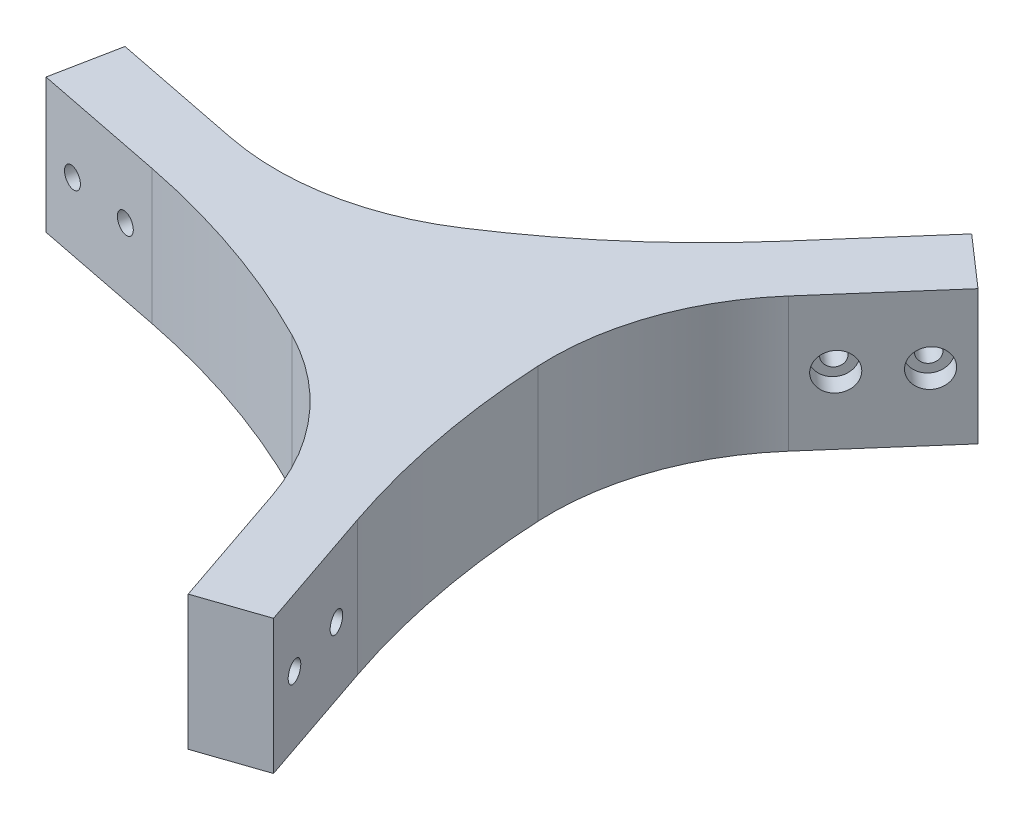
ISO-10303-21;
HEADER;
FILE_DESCRIPTION(('STEP AP214'),'2;1');
FILE_NAME('part.step','',(''),(''),'','','');
FILE_SCHEMA(('AUTOMOTIVE_DESIGN { 1 0 10303 214 1 1 1 1 }'));
ENDSEC;
DATA;
#1=APPLICATION_CONTEXT('core data for automotive mechanical design processes');
#2=APPLICATION_PROTOCOL_DEFINITION('international standard','automotive_design',2000,#1);
#3=PRODUCT_CONTEXT('',#1,'mechanical');
#4=PRODUCT('Part','Part','',(#3));
#5=PRODUCT_RELATED_PRODUCT_CATEGORY('part','',(#4));
#6=PRODUCT_DEFINITION_FORMATION('','',#4);
#7=PRODUCT_DEFINITION_CONTEXT('part definition',#1,'design');
#8=PRODUCT_DEFINITION('design','',#6,#7);
#9=PRODUCT_DEFINITION_SHAPE('','',#8);
#10=(LENGTH_UNIT() NAMED_UNIT(*) SI_UNIT(.MILLI.,.METRE.));
#11=(NAMED_UNIT(*) PLANE_ANGLE_UNIT() SI_UNIT($,.RADIAN.));
#12=(NAMED_UNIT(*) SI_UNIT($,.STERADIAN.) SOLID_ANGLE_UNIT());
#13=UNCERTAINTY_MEASURE_WITH_UNIT(LENGTH_MEASURE(1.E-05),#10,'distance_accuracy_value','');
#14=(GEOMETRIC_REPRESENTATION_CONTEXT(3) GLOBAL_UNCERTAINTY_ASSIGNED_CONTEXT((#13)) GLOBAL_UNIT_ASSIGNED_CONTEXT((#10,
#11,#12)) REPRESENTATION_CONTEXT('',''));
#15=CARTESIAN_POINT('',(0.,0.,0.));
#16=DIRECTION('',(0.,0.,1.));
#17=DIRECTION('',(1.,0.,0.));
#18=AXIS2_PLACEMENT_3D('',#15,#16,#17);
#19=CARTESIAN_POINT('',(63.1206723380462,10.,23.6419072247922));
#20=DIRECTION('',(-0.946570066276687,0.,0.322498231978018));
#21=DIRECTION('',(0.322498231978018,0.,0.946570066276687));
#22=AXIS2_PLACEMENT_3D('',#19,#20,#21);
#23=CYLINDRICAL_SURFACE('',#22,1.50000000000001);
#24=CARTESIAN_POINT('',(23.2476712876655,10.,37.2267149432382));
#25=DIRECTION('',(-0.946570066276686,0.,0.322498231978023));
#26=DIRECTION('',(0.322498231978023,0.,0.946570066276686));
#27=AXIS2_PLACEMENT_3D('',#24,#25,#26);
#28=CIRCLE('',#27,1.50000000000001);
#29=CARTESIAN_POINT('',(23.7314186356326,10.,38.6465700426532));
#30=VERTEX_POINT('',#29);
#31=EDGE_CURVE('E283',#30,#30,#28,.T.);
#32=ORIENTED_EDGE('',*,*,#31,.F.);
#33=EDGE_LOOP('',(#32));
#34=FACE_BOUND('',#33,.T.);
#35=CARTESIAN_POINT('',(16.6216808237285,10.,39.4842025670844));
#36=DIRECTION('',(-0.946570066276688,0.,0.322498231978018));
#37=DIRECTION('',(0.322498231978018,0.,0.946570066276688));
#38=AXIS2_PLACEMENT_3D('',#35,#36,#37);
#39=CIRCLE('',#38,1.50000000000001);
#40=CARTESIAN_POINT('',(17.1054281716955,10.,40.9040576664994));
#41=VERTEX_POINT('',#40);
#42=EDGE_CURVE('E369',#41,#41,#39,.T.);
#43=ORIENTED_EDGE('',*,*,#42,.T.);
#44=EDGE_LOOP('',(#43));
#45=FACE_BOUND('',#44,.T.);
#46=ADVANCED_FACE('F39',(#34,#45),#23,.F.);
#47=CARTESIAN_POINT('',(66.3456546578264,10.,33.1076078875591));
#48=DIRECTION('',(-0.946570066276687,0.,0.322498231978018));
#49=DIRECTION('',(0.322498231978018,0.,0.946570066276687));
#50=AXIS2_PLACEMENT_3D('',#47,#48,#49);
#51=CYLINDRICAL_SURFACE('',#50,1.5);
#52=CARTESIAN_POINT('',(26.4726536074458,10.,46.692415606005));
#53=DIRECTION('',(-0.946570066276686,0.,0.322498231978023));
#54=DIRECTION('',(0.322498231978023,0.,0.946570066276686));
#55=AXIS2_PLACEMENT_3D('',#52,#53,#54);
#56=CIRCLE('',#55,1.5);
#57=CARTESIAN_POINT('',(26.9564009554128,10.,48.1122707054201));
#58=VERTEX_POINT('',#57);
#59=EDGE_CURVE('E287',#58,#58,#56,.T.);
#60=ORIENTED_EDGE('',*,*,#59,.F.);
#61=EDGE_LOOP('',(#60));
#62=FACE_BOUND('',#61,.T.);
#63=CARTESIAN_POINT('',(19.8466631435087,10.,48.9499032298513));
#64=DIRECTION('',(-0.946570066276688,0.,0.322498231978018));
#65=DIRECTION('',(0.322498231978018,0.,0.946570066276688));
#66=AXIS2_PLACEMENT_3D('',#63,#64,#65);
#67=CIRCLE('',#66,1.5);
#68=CARTESIAN_POINT('',(20.3304104914757,10.,50.3697583292663));
#69=VERTEX_POINT('',#68);
#70=EDGE_CURVE('E382',#69,#69,#67,.T.);
#71=ORIENTED_EDGE('',*,*,#70,.T.);
#72=EDGE_LOOP('',(#71));
#73=FACE_BOUND('',#72,.T.);
#74=ADVANCED_FACE('F408',(#62,#73),#51,.F.);
#75=CARTESIAN_POINT('',(-64.3380902031083,10.,53.5112215256977));
#76=DIRECTION('',(0.193993371569817,0.,-0.981002839846539));
#77=DIRECTION('',(-0.981002839846539,0.,-0.193993371569817));
#78=AXIS2_PLACEMENT_3D('',#75,#76,#77);
#79=CYLINDRICAL_SURFACE('',#78,1.5);
#80=CARTESIAN_POINT('',(-53.6731448825843,10.,-0.420217273368641));
#81=DIRECTION('',(0.193993371569808,0.,-0.981002839846541));
#82=DIRECTION('',(-0.981002839846541,0.,-0.193993371569808));
#83=AXIS2_PLACEMENT_3D('',#80,#81,#82);
#84=CIRCLE('',#83,1.5);
#85=CARTESIAN_POINT('',(-55.1446491423541,10.,-0.711207330723353));
#86=VERTEX_POINT('',#85);
#87=EDGE_CURVE('E291',#86,#86,#84,.T.);
#88=ORIENTED_EDGE('',*,*,#87,.F.);
#89=EDGE_LOOP('',(#88));
#90=FACE_BOUND('',#89,.T.);
#91=CARTESIAN_POINT('',(-52.3151912815954,10.,-7.28723715229501));
#92=DIRECTION('',(0.193993371569817,0.,-0.981002839846539));
#93=DIRECTION('',(-0.981002839846539,0.,-0.193993371569817));
#94=AXIS2_PLACEMENT_3D('',#91,#92,#93);
#95=CIRCLE('',#94,1.5);
#96=CARTESIAN_POINT('',(-53.7866955413652,10.,-7.57822720964974));
#97=VERTEX_POINT('',#96);
#98=EDGE_CURVE('E365',#97,#97,#95,.T.);
#99=ORIENTED_EDGE('',*,*,#98,.T.);
#100=EDGE_LOOP('',(#99));
#101=FACE_BOUND('',#100,.T.);
#102=ADVANCED_FACE('F462',(#90,#101),#79,.F.);
#103=CARTESIAN_POINT('',(-54.5280618046429,10.,55.4511552413959));
#104=DIRECTION('',(0.193993371569817,0.,-0.981002839846539));
#105=DIRECTION('',(-0.981002839846539,0.,-0.193993371569817));
#106=AXIS2_PLACEMENT_3D('',#103,#104,#105);
#107=CYLINDRICAL_SURFACE('',#106,1.50000000000001);
#108=CARTESIAN_POINT('',(-43.8631164841188,10.,1.51971644232944));
#109=DIRECTION('',(0.193993371569808,0.,-0.981002839846541));
#110=DIRECTION('',(-0.981002839846541,0.,-0.193993371569808));
#111=AXIS2_PLACEMENT_3D('',#108,#109,#110);
#112=CIRCLE('',#111,1.50000000000001);
#113=CARTESIAN_POINT('',(-45.3346207438887,10.,1.22872638497473));
#114=VERTEX_POINT('',#113);
#115=EDGE_CURVE('E43',#114,#114,#112,.T.);
#116=ORIENTED_EDGE('',*,*,#115,.F.);
#117=EDGE_LOOP('',(#116));
#118=FACE_BOUND('',#117,.T.);
#119=CARTESIAN_POINT('',(-42.50516288313,10.,-5.34730343659684));
#120=DIRECTION('',(0.193993371569817,0.,-0.981002839846539));
#121=DIRECTION('',(-0.981002839846539,0.,-0.193993371569817));
#122=AXIS2_PLACEMENT_3D('',#119,#120,#121);
#123=CIRCLE('',#122,1.50000000000001);
#124=CARTESIAN_POINT('',(-43.9766671428998,10.,-5.63829349395156));
#125=VERTEX_POINT('',#124);
#126=EDGE_CURVE('E390',#125,#125,#123,.T.);
#127=ORIENTED_EDGE('',*,*,#126,.T.);
#128=EDGE_LOOP('',(#127));
#129=FACE_BOUND('',#128,.T.);
#130=ADVANCED_FACE('F469',(#118,#129),#107,.F.);
#131=CARTESIAN_POINT('',(-29.8319450456978,10.,-82.8878978474497));
#132=DIRECTION('',(0.752576694706878,0.,0.658504607868518));
#133=DIRECTION('',(0.658504607868518,0.,-0.752576694706878));
#134=AXIS2_PLACEMENT_3D('',#131,#132,#133);
#135=CYLINDRICAL_SURFACE('',#134,1.50000000000001);
#136=CARTESIAN_POINT('',(20.6154451964532,10.,-38.7464313855675));
#137=DIRECTION('',(0.752576694706877,0.,0.658504607868519));
#138=DIRECTION('',(0.658504607868519,0.,-0.752576694706877));
#139=AXIS2_PLACEMENT_3D('',#136,#137,#138);
#140=CIRCLE('',#139,1.50000000000001);
#141=CARTESIAN_POINT('',(21.603202108256,10.,-39.8752964276278));
#142=VERTEX_POINT('',#141);
#143=EDGE_CURVE('E275',#142,#142,#140,.T.);
#144=ORIENTED_EDGE('',*,*,#143,.F.);
#145=EDGE_LOOP('',(#144));
#146=FACE_BOUND('',#145,.T.);
#147=CARTESIAN_POINT('',(25.8834820594014,10.,-34.1368991304878));
#148=DIRECTION('',(0.752576694706878,0.,0.658504607868518));
#149=DIRECTION('',(0.658504607868518,0.,-0.752576694706878));
#150=AXIS2_PLACEMENT_3D('',#147,#148,#149);
#151=CIRCLE('',#150,1.50000000000001);
#152=CARTESIAN_POINT('',(26.8712389712042,10.,-35.2657641725482));
#153=VERTEX_POINT('',#152);
#154=EDGE_CURVE('E298',#153,#153,#151,.T.);
#155=ORIENTED_EDGE('',*,*,#154,.T.);
#156=EDGE_LOOP('',(#155));
#157=FACE_BOUND('',#156,.T.);
#158=ADVANCED_FACE('F490',(#146,#157),#135,.F.);
#159=CARTESIAN_POINT('',(-23.2468989670126,10.,-90.4136647945185));
#160=DIRECTION('',(0.752576694706878,0.,0.658504607868518));
#161=DIRECTION('',(0.658504607868518,0.,-0.752576694706878));
#162=AXIS2_PLACEMENT_3D('',#159,#160,#161);
#163=CYLINDRICAL_SURFACE('',#162,1.5);
#164=CARTESIAN_POINT('',(27.2004912751384,10.,-46.2721983326362));
#165=DIRECTION('',(0.752576694706877,0.,0.658504607868519));
#166=DIRECTION('',(0.658504607868519,0.,-0.752576694706877));
#167=AXIS2_PLACEMENT_3D('',#164,#165,#166);
#168=CIRCLE('',#167,1.5);
#169=CARTESIAN_POINT('',(28.1882481869412,10.,-47.4010633746966));
#170=VERTEX_POINT('',#169);
#171=EDGE_CURVE('E190',#170,#170,#168,.T.);
#172=ORIENTED_EDGE('',*,*,#171,.F.);
#173=EDGE_LOOP('',(#172));
#174=FACE_BOUND('',#173,.T.);
#175=CARTESIAN_POINT('',(32.4685281380866,10.,-41.6626660775566));
#176=DIRECTION('',(0.752576694706878,0.,0.658504607868518));
#177=DIRECTION('',(0.658504607868518,0.,-0.752576694706878));
#178=AXIS2_PLACEMENT_3D('',#175,#176,#177);
#179=CIRCLE('',#178,1.5);
#180=CARTESIAN_POINT('',(33.4562850498894,10.,-42.7915311196169));
#181=VERTEX_POINT('',#180);
#182=EDGE_CURVE('E317',#181,#181,#179,.T.);
#183=ORIENTED_EDGE('',*,*,#182,.T.);
#184=EDGE_LOOP('',(#183));
#185=FACE_BOUND('',#184,.T.);
#186=ADVANCED_FACE('F487',(#174,#185),#163,.F.);
#187=CARTESIAN_POINT('',(38.0187812615498,20.,-43.4500357274855));
#188=DIRECTION('',(-0.752576694706878,0.,-0.658504607868518));
#189=DIRECTION('',(-0.658504607868518,0.,0.752576694706878));
#190=AXIS2_PLACEMENT_3D('',#187,#188,#189);
#191=PLANE('',#190);
#192=CARTESIAN_POINT('',(34.7262582222072,10.,-39.6871522539511));
#193=DIRECTION('',(0.752576694706878,0.,0.658504607868518));
#194=DIRECTION('',(0.658504607868518,0.,-0.752576694706878));
#195=AXIS2_PLACEMENT_3D('',#192,#193,#194);
#196=CIRCLE('',#195,2.75);
#197=CARTESIAN_POINT('',(36.5371458938456,10.,-41.756738164395));
#198=VERTEX_POINT('',#197);
#199=EDGE_CURVE('E313',#198,#198,#196,.T.);
#200=ORIENTED_EDGE('',*,*,#199,.F.);
#201=EDGE_LOOP('',(#200));
#202=FACE_BOUND('',#201,.T.);
#203=CARTESIAN_POINT('',(28.141212143522,10.,-32.1613853068823));
#204=DIRECTION('',(0.752576694706878,0.,0.658504607868518));
#205=DIRECTION('',(0.658504607868518,0.,-0.752576694706878));
#206=AXIS2_PLACEMENT_3D('',#203,#204,#205);
#207=CIRCLE('',#206,2.75);
#208=CARTESIAN_POINT('',(29.9520998151605,10.,-34.2309712173262));
#209=VERTEX_POINT('',#208);
#210=EDGE_CURVE('E303',#209,#209,#207,.T.);
#211=ORIENTED_EDGE('',*,*,#210,.F.);
#212=EDGE_LOOP('',(#211));
#213=FACE_BOUND('',#212,.T.);
#214=DIRECTION('',(0.658504607868518,0.,-0.752576694706878));
#215=VECTOR('',#214,1.);
#216=CARTESIAN_POINT('',(38.0187812615498,0.,-43.4500357274855));
#217=LINE('',#216,#215);
#218=CARTESIAN_POINT('',(24.8486891041794,0.,-28.3985018333479));
#219=VERTEX_POINT('',#218);
#220=CARTESIAN_POINT('',(38.0187812615498,0.,-43.4500357274855));
#221=VERTEX_POINT('',#220);
#222=EDGE_CURVE('E185',#219,#221,#217,.T.);
#223=ORIENTED_EDGE('',*,*,#222,.T.);
#224=DIRECTION('',(0.,-1.,0.));
#225=VECTOR('',#224,1.);
#226=CARTESIAN_POINT('',(38.0187812615498,20.,-43.4500357274855));
#227=LINE('',#226,#225);
#228=CARTESIAN_POINT('',(38.0187812615498,20.,-43.4500357274855));
#229=VERTEX_POINT('',#228);
#230=EDGE_CURVE('E11',#229,#221,#227,.T.);
#231=ORIENTED_EDGE('',*,*,#230,.F.);
#232=DIRECTION('',(0.658504607868518,0.,-0.752576694706878));
#233=VECTOR('',#232,1.);
#234=CARTESIAN_POINT('',(38.0187812615498,20.,-43.4500357274855));
#235=LINE('',#234,#233);
#236=CARTESIAN_POINT('',(24.8486891041794,20.,-28.3985018333479));
#237=VERTEX_POINT('',#236);
#238=EDGE_CURVE('E229',#237,#229,#235,.T.);
#239=ORIENTED_EDGE('',*,*,#238,.F.);
#240=DIRECTION('',(0.,-1.,0.));
#241=VECTOR('',#240,1.);
#242=CARTESIAN_POINT('',(24.8486891041794,20.,-28.3985018333479));
#243=LINE('',#242,#241);
#244=EDGE_CURVE('E181',#237,#219,#243,.T.);
#245=ORIENTED_EDGE('',*,*,#244,.T.);
#246=EDGE_LOOP('',(#223,#231,#239,#245));
#247=FACE_BOUND('',#246,.T.);
#248=ADVANCED_FACE('F41',(#202,#213,#247),#191,.F.);
#249=CARTESIAN_POINT('',(30.493014314481,20.,-50.0350818061707));
#250=DIRECTION('',(-0.65850460786852,0.,0.752576694706877));
#251=DIRECTION('',(0.752576694706877,0.,0.65850460786852));
#252=AXIS2_PLACEMENT_3D('',#249,#250,#251);
#253=PLANE('',#252);
#254=DIRECTION('',(-0.752576694706877,0.,-0.65850460786852));
#255=VECTOR('',#254,1.);
#256=CARTESIAN_POINT('',(30.493014314481,0.,-50.0350818061707));
#257=LINE('',#256,#255);
#258=CARTESIAN_POINT('',(30.493014314481,0.,-50.0350818061707));
#259=VERTEX_POINT('',#258);
#260=EDGE_CURVE('E189',#221,#259,#257,.T.);
#261=ORIENTED_EDGE('',*,*,#260,.T.);
#262=DIRECTION('',(0.,-1.,0.));
#263=VECTOR('',#262,1.);
#264=CARTESIAN_POINT('',(30.493014314481,20.,-50.0350818061707));
#265=LINE('',#264,#263);
#266=CARTESIAN_POINT('',(30.493014314481,20.,-50.0350818061707));
#267=VERTEX_POINT('',#266);
#268=EDGE_CURVE('E50',#267,#259,#265,.T.);
#269=ORIENTED_EDGE('',*,*,#268,.F.);
#270=DIRECTION('',(-0.752576694706877,0.,-0.65850460786852));
#271=VECTOR('',#270,1.);
#272=CARTESIAN_POINT('',(30.493014314481,20.,-50.0350818061707));
#273=LINE('',#272,#271);
#274=EDGE_CURVE('E123',#229,#267,#273,.T.);
#275=ORIENTED_EDGE('',*,*,#274,.F.);
#276=ORIENTED_EDGE('',*,*,#230,.T.);
#277=EDGE_LOOP('',(#261,#269,#275,#276));
#278=FACE_BOUND('',#277,.T.);
#279=ADVANCED_FACE('F733',(#278),#253,.F.);
#280=CARTESIAN_POINT('',(30.493014314481,20.,-50.0350818061707));
#281=DIRECTION('',(0.752576694706877,0.,0.658504607868519));
#282=DIRECTION('',(0.658504607868519,0.,-0.752576694706877));
#283=AXIS2_PLACEMENT_3D('',#280,#281,#282);
#284=PLANE('',#283);
#285=ORIENTED_EDGE('',*,*,#171,.T.);
#286=EDGE_LOOP('',(#285));
#287=FACE_BOUND('',#286,.T.);
#288=ORIENTED_EDGE('',*,*,#143,.T.);
#289=EDGE_LOOP('',(#288));
#290=FACE_BOUND('',#289,.T.);
#291=DIRECTION('',(-0.658504607868519,0.,0.752576694706877));
#292=VECTOR('',#291,1.);
#293=CARTESIAN_POINT('',(30.493014314481,0.,-50.0350818061707));
#294=LINE('',#293,#292);
#295=CARTESIAN_POINT('',(17.3229221571107,0.,-34.9835479120331));
#296=VERTEX_POINT('',#295);
#297=EDGE_CURVE('E193',#259,#296,#294,.T.);
#298=ORIENTED_EDGE('',*,*,#297,.T.);
#299=DIRECTION('',(0.,-1.,0.));
#300=VECTOR('',#299,1.);
#301=CARTESIAN_POINT('',(17.3229221571107,20.,-34.9835479120331));
#302=LINE('',#301,#300);
#303=CARTESIAN_POINT('',(17.3229221571107,20.,-34.9835479120331));
#304=VERTEX_POINT('',#303);
#305=EDGE_CURVE('E268',#304,#296,#302,.T.);
#306=ORIENTED_EDGE('',*,*,#305,.F.);
#307=DIRECTION('',(-0.658504607868519,0.,0.752576694706877));
#308=VECTOR('',#307,1.);
#309=CARTESIAN_POINT('',(30.493014314481,20.,-50.0350818061707));
#310=LINE('',#309,#308);
#311=EDGE_CURVE('E323',#267,#304,#310,.T.);
#312=ORIENTED_EDGE('',*,*,#311,.F.);
#313=ORIENTED_EDGE('',*,*,#268,.T.);
#314=EDGE_LOOP('',(#298,#306,#312,#313));
#315=FACE_BOUND('',#314,.T.);
#316=ADVANCED_FACE('F724',(#287,#290,#315),#284,.F.);
#317=CARTESIAN_POINT('',(-74.7117990400485,20.,-115.513928959552));
#318=DIRECTION('',(0.,-1.,0.));
#319=DIRECTION('',(0.,0.,-1.));
#320=AXIS2_PLACEMENT_3D('',#317,#318,#319);
#321=CYLINDRICAL_SURFACE('',#320,122.292813270026);
#322=CARTESIAN_POINT('',(-74.7117990400485,0.,-115.513928959552));
#323=DIRECTION('',(0.,-1.,0.));
#324=DIRECTION('',(0.,0.,-1.));
#325=AXIS2_PLACEMENT_3D('',#322,#323,#324);
#326=CIRCLE('',#325,122.292813270026);
#327=CARTESIAN_POINT('',(-8.29644283677108,0.,-12.8273541900656));
#328=VERTEX_POINT('',#327);
#329=EDGE_CURVE('E196',#296,#328,#326,.T.);
#330=ORIENTED_EDGE('',*,*,#329,.T.);
#331=DIRECTION('',(0.,-1.,0.));
#332=VECTOR('',#331,1.);
#333=CARTESIAN_POINT('',(-8.29644283677108,20.,-12.8273541900656));
#334=LINE('',#333,#332);
#335=CARTESIAN_POINT('',(-8.29644283677108,20.,-12.8273541900656));
#336=VERTEX_POINT('',#335);
#337=EDGE_CURVE('E264',#336,#328,#334,.T.);
#338=ORIENTED_EDGE('',*,*,#337,.F.);
#339=CARTESIAN_POINT('',(-74.7117990400485,20.,-115.513928959552));
#340=DIRECTION('',(0.,-1.,0.));
#341=DIRECTION('',(0.,0.,-1.));
#342=AXIS2_PLACEMENT_3D('',#339,#340,#341);
#343=CIRCLE('',#342,122.292813270026);
#344=EDGE_CURVE('E326',#304,#336,#343,.T.);
#345=ORIENTED_EDGE('',*,*,#344,.F.);
#346=ORIENTED_EDGE('',*,*,#305,.T.);
#347=EDGE_LOOP('',(#330,#338,#345,#346));
#348=FACE_BOUND('',#347,.T.);
#349=ADVANCED_FACE('F715',(#348),#321,.F.);
#350=CARTESIAN_POINT('',(-29.4588277034815,20.,-45.5470886030649));
#351=DIRECTION('',(0.,-1.,0.));
#352=DIRECTION('',(0.,0.,-1.));
#353=AXIS2_PLACEMENT_3D('',#350,#351,#352);
#354=CYLINDRICAL_SURFACE('',#353,38.9670059576559);
#355=CARTESIAN_POINT('',(-29.4588277034815,0.,-45.5470886030649));
#356=DIRECTION('',(0.,-1.,0.));
#357=DIRECTION('',(0.,0.,1.));
#358=AXIS2_PLACEMENT_3D('',#355,#356,#357);
#359=CIRCLE('',#358,38.9670059576559);
#360=CARTESIAN_POINT('',(-37.0181685691822,0.,-7.32034509828632));
#361=VERTEX_POINT('',#360);
#362=EDGE_CURVE('E199',#328,#361,#359,.T.);
#363=ORIENTED_EDGE('',*,*,#362,.T.);
#364=DIRECTION('',(0.,-1.,0.));
#365=VECTOR('',#364,1.);
#366=CARTESIAN_POINT('',(-37.0181685691822,20.,-7.32034509828632));
#367=LINE('',#366,#365);
#368=CARTESIAN_POINT('',(-37.0181685691822,20.,-7.32034509828632));
#369=VERTEX_POINT('',#368);
#370=EDGE_CURVE('E260',#369,#361,#367,.T.);
#371=ORIENTED_EDGE('',*,*,#370,.F.);
#372=CARTESIAN_POINT('',(-29.4588277034815,20.,-45.5470886030649));
#373=DIRECTION('',(0.,-1.,0.));
#374=DIRECTION('',(0.,0.,1.));
#375=AXIS2_PLACEMENT_3D('',#372,#373,#374);
#376=CIRCLE('',#375,38.9670059576559);
#377=EDGE_CURVE('E329',#336,#369,#376,.T.);
#378=ORIENTED_EDGE('',*,*,#377,.F.);
#379=ORIENTED_EDGE('',*,*,#337,.T.);
#380=EDGE_LOOP('',(#363,#371,#378,#379));
#381=FACE_BOUND('',#380,.T.);
#382=ADVANCED_FACE('F707',(#381),#354,.F.);
#383=CARTESIAN_POINT('',(-56.6382253661129,20.,-11.2002125296829));
#384=DIRECTION('',(-0.193993371569807,0.,0.981002839846541));
#385=DIRECTION('',(0.981002839846541,0.,0.193993371569807));
#386=AXIS2_PLACEMENT_3D('',#383,#384,#385);
#387=PLANE('',#386);
#388=CARTESIAN_POINT('',(-41.9231827684206,10.,-8.29031195613646));
#389=DIRECTION('',(0.193993371569817,0.,-0.981002839846539));
#390=DIRECTION('',(-0.981002839846539,0.,-0.193993371569817));
#391=AXIS2_PLACEMENT_3D('',#388,#389,#390);
#392=CIRCLE('',#391,2.75);
#393=CARTESIAN_POINT('',(-44.6209405779986,10.,-8.82379372795345));
#394=VERTEX_POINT('',#393);
#395=EDGE_CURVE('E386',#394,#394,#392,.T.);
#396=ORIENTED_EDGE('',*,*,#395,.F.);
#397=EDGE_LOOP('',(#396));
#398=FACE_BOUND('',#397,.T.);
#399=CARTESIAN_POINT('',(-51.733211166886,10.,-10.2302456718346));
#400=DIRECTION('',(0.193993371569817,0.,-0.981002839846539));
#401=DIRECTION('',(-0.981002839846539,0.,-0.193993371569817));
#402=AXIS2_PLACEMENT_3D('',#399,#400,#401);
#403=CIRCLE('',#402,2.75);
#404=CARTESIAN_POINT('',(-54.430968976464,10.,-10.7637274436516));
#405=VERTEX_POINT('',#404);
#406=EDGE_CURVE('E360',#405,#405,#403,.T.);
#407=ORIENTED_EDGE('',*,*,#406,.F.);
#408=EDGE_LOOP('',(#407));
#409=FACE_BOUND('',#408,.T.);
#410=DIRECTION('',(-0.981002839846541,0.,-0.193993371569807));
#411=VECTOR('',#410,1.);
#412=CARTESIAN_POINT('',(-56.6382253661129,0.,-11.2002125296829));
#413=LINE('',#412,#411);
#414=CARTESIAN_POINT('',(-56.6382253661129,0.,-11.2002125296829));
#415=VERTEX_POINT('',#414);
#416=EDGE_CURVE('E202',#361,#415,#413,.T.);
#417=ORIENTED_EDGE('',*,*,#416,.T.);
#418=DIRECTION('',(0.,-1.,0.));
#419=VECTOR('',#418,1.);
#420=CARTESIAN_POINT('',(-56.6382253661129,20.,-11.2002125296829));
#421=LINE('',#420,#419);
#422=CARTESIAN_POINT('',(-56.6382253661129,20.,-11.2002125296829));
#423=VERTEX_POINT('',#422);
#424=EDGE_CURVE('E256',#423,#415,#421,.T.);
#425=ORIENTED_EDGE('',*,*,#424,.F.);
#426=DIRECTION('',(-0.981002839846541,0.,-0.193993371569807));
#427=VECTOR('',#426,1.);
#428=CARTESIAN_POINT('',(-56.6382253661129,20.,-11.2002125296829));
#429=LINE('',#428,#427);
#430=EDGE_CURVE('E332',#369,#423,#429,.T.);
#431=ORIENTED_EDGE('',*,*,#430,.F.);
#432=ORIENTED_EDGE('',*,*,#370,.T.);
#433=EDGE_LOOP('',(#417,#425,#431,#432));
#434=FACE_BOUND('',#433,.T.);
#435=ADVANCED_FACE('F698',(#398,#409,#434),#387,.F.);
#436=CARTESIAN_POINT('',(-58.5781590818169,20.,-1.39018413121768));
#437=DIRECTION('',(0.981002839846428,0.,0.193993371570382));
#438=DIRECTION('',(0.193993371570382,0.,-0.981002839846428));
#439=AXIS2_PLACEMENT_3D('',#436,#437,#438);
#440=PLANE('',#439);
#441=DIRECTION('',(-0.193993371570382,0.,0.981002839846427));
#442=VECTOR('',#441,1.);
#443=CARTESIAN_POINT('',(-58.5781590818169,0.,-1.39018413121768));
#444=LINE('',#443,#442);
#445=CARTESIAN_POINT('',(-58.5781590818169,0.,-1.39018413121768));
#446=VERTEX_POINT('',#445);
#447=EDGE_CURVE('E205',#415,#446,#444,.T.);
#448=ORIENTED_EDGE('',*,*,#447,.T.);
#449=DIRECTION('',(0.,-1.,0.));
#450=VECTOR('',#449,1.);
#451=CARTESIAN_POINT('',(-58.5781590818169,20.,-1.39018413121768));
#452=LINE('',#451,#450);
#453=CARTESIAN_POINT('',(-58.5781590818169,20.,-1.39018413121768));
#454=VERTEX_POINT('',#453);
#455=EDGE_CURVE('E252',#454,#446,#452,.T.);
#456=ORIENTED_EDGE('',*,*,#455,.F.);
#457=DIRECTION('',(-0.193993371570382,0.,0.981002839846427));
#458=VECTOR('',#457,1.);
#459=CARTESIAN_POINT('',(-58.5781590818169,20.,-1.39018413121768));
#460=LINE('',#459,#458);
#461=EDGE_CURVE('E335',#423,#454,#460,.T.);
#462=ORIENTED_EDGE('',*,*,#461,.F.);
#463=ORIENTED_EDGE('',*,*,#424,.T.);
#464=EDGE_LOOP('',(#448,#456,#462,#463));
#465=FACE_BOUND('',#464,.T.);
#466=ADVANCED_FACE('F691',(#465),#440,.F.);
#467=CARTESIAN_POINT('',(-58.5781590818169,20.,-1.39018413121768));
#468=DIRECTION('',(0.193993371569808,0.,-0.981002839846541));
#469=DIRECTION('',(-0.981002839846541,0.,-0.193993371569808));
#470=AXIS2_PLACEMENT_3D('',#467,#468,#469);
#471=PLANE('',#470);
#472=ORIENTED_EDGE('',*,*,#115,.T.);
#473=EDGE_LOOP('',(#472));
#474=FACE_BOUND('',#473,.T.);
#475=ORIENTED_EDGE('',*,*,#87,.T.);
#476=EDGE_LOOP('',(#475));
#477=FACE_BOUND('',#476,.T.);
#478=DIRECTION('',(0.981002839846541,0.,0.193993371569808));
#479=VECTOR('',#478,1.);
#480=CARTESIAN_POINT('',(-58.5781590818169,0.,-1.39018413121768));
#481=LINE('',#480,#479);
#482=CARTESIAN_POINT('',(-38.9581022848861,0.,2.48968330017848));
#483=VERTEX_POINT('',#482);
#484=EDGE_CURVE('E208',#446,#483,#481,.T.);
#485=ORIENTED_EDGE('',*,*,#484,.T.);
#486=DIRECTION('',(0.,-1.,0.));
#487=VECTOR('',#486,1.);
#488=CARTESIAN_POINT('',(-38.9581022848861,20.,2.48968330017848));
#489=LINE('',#488,#487);
#490=CARTESIAN_POINT('',(-38.9581022848861,20.,2.48968330017848));
#491=VERTEX_POINT('',#490);
#492=EDGE_CURVE('E248',#491,#483,#489,.T.);
#493=ORIENTED_EDGE('',*,*,#492,.F.);
#494=DIRECTION('',(0.981002839846541,0.,0.193993371569808));
#495=VECTOR('',#494,1.);
#496=CARTESIAN_POINT('',(-58.5781590818169,20.,-1.39018413121768));
#497=LINE('',#496,#495);
#498=EDGE_CURVE('E338',#454,#491,#497,.T.);
#499=ORIENTED_EDGE('',*,*,#498,.F.);
#500=ORIENTED_EDGE('',*,*,#455,.T.);
#501=EDGE_LOOP('',(#485,#493,#499,#500));
#502=FACE_BOUND('',#501,.T.);
#503=ADVANCED_FACE('F682',(#474,#477,#502),#471,.F.);
#504=CARTESIAN_POINT('',(-62.6820974498933,20.,122.459280410893));
#505=DIRECTION('',(0.,-1.,0.));
#506=DIRECTION('',(0.,0.,-1.));
#507=AXIS2_PLACEMENT_3D('',#504,#505,#506);
#508=CYLINDRICAL_SURFACE('',#507,122.292813270022);
#509=CARTESIAN_POINT('',(-62.6820974498933,0.,122.459280410893));
#510=DIRECTION('',(0.,-1.,0.));
#511=DIRECTION('',(0.,0.,-1.));
#512=AXIS2_PLACEMENT_3D('',#509,#510,#511);
#513=CIRCLE('',#512,122.292813270022);
#514=CARTESIAN_POINT('',(-6.96059317355181,0.,13.5986073527216));
#515=VERTEX_POINT('',#514);
#516=EDGE_CURVE('E211',#483,#515,#513,.T.);
#517=ORIENTED_EDGE('',*,*,#516,.T.);
#518=DIRECTION('',(0.,-1.,0.));
#519=VECTOR('',#518,1.);
#520=CARTESIAN_POINT('',(-6.96059317355181,20.,13.5986073527216));
#521=LINE('',#520,#519);
#522=CARTESIAN_POINT('',(-6.96059317355181,20.,13.5986073527216));
#523=VERTEX_POINT('',#522);
#524=EDGE_CURVE('E244',#523,#515,#521,.T.);
#525=ORIENTED_EDGE('',*,*,#524,.F.);
#526=CARTESIAN_POINT('',(-62.6820974498933,20.,122.459280410893));
#527=DIRECTION('',(0.,-1.,0.));
#528=DIRECTION('',(0.,0.,-1.));
#529=AXIS2_PLACEMENT_3D('',#526,#527,#528);
#530=CIRCLE('',#529,122.292813270022);
#531=EDGE_CURVE('E341',#491,#523,#530,.T.);
#532=ORIENTED_EDGE('',*,*,#531,.F.);
#533=ORIENTED_EDGE('',*,*,#492,.T.);
#534=EDGE_LOOP('',(#517,#525,#532,#533));
#535=FACE_BOUND('',#534,.T.);
#536=ADVANCED_FACE('F673',(#535),#508,.F.);
#537=CARTESIAN_POINT('',(-24.7155219469342,20.,48.2856374584563));
#538=DIRECTION('',(0.,-1.,0.));
#539=DIRECTION('',(0.,0.,-1.));
#540=AXIS2_PLACEMENT_3D('',#537,#538,#539);
#541=CYLINDRICAL_SURFACE('',#540,38.9670059576586);
#542=CARTESIAN_POINT('',(-24.7155219469342,0.,48.2856374584563));
#543=DIRECTION('',(0.,-1.,0.));
#544=DIRECTION('',(0.,0.,1.));
#545=AXIS2_PLACEMENT_3D('',#542,#543,#544);
#546=CIRCLE('',#545,38.9670059576586);
#547=CARTESIAN_POINT('',(12.1694794650095,0.,35.7188469316307));
#548=VERTEX_POINT('',#547);
#549=EDGE_CURVE('E214',#515,#548,#546,.T.);
#550=ORIENTED_EDGE('',*,*,#549,.T.);
#551=DIRECTION('',(0.,-1.,0.));
#552=VECTOR('',#551,1.);
#553=CARTESIAN_POINT('',(12.1694794650095,20.,35.7188469316307));
#554=LINE('',#553,#552);
#555=CARTESIAN_POINT('',(12.1694794650095,20.,35.7188469316307));
#556=VERTEX_POINT('',#555);
#557=EDGE_CURVE('E240',#556,#548,#554,.T.);
#558=ORIENTED_EDGE('',*,*,#557,.F.);
#559=CARTESIAN_POINT('',(-24.7155219469342,20.,48.2856374584563));
#560=DIRECTION('',(0.,-1.,0.));
#561=DIRECTION('',(0.,0.,1.));
#562=AXIS2_PLACEMENT_3D('',#559,#560,#561);
#563=CIRCLE('',#562,38.9670059576586);
#564=EDGE_CURVE('E344',#523,#556,#563,.T.);
#565=ORIENTED_EDGE('',*,*,#564,.F.);
#566=ORIENTED_EDGE('',*,*,#524,.T.);
#567=EDGE_LOOP('',(#550,#558,#565,#566));
#568=FACE_BOUND('',#567,.T.);
#569=ADVANCED_FACE('F428',(#568),#541,.F.);
#570=CARTESIAN_POINT('',(18.6194441045721,20.,54.6502482571637));
#571=DIRECTION('',(0.946570066276686,0.,-0.322498231978023));
#572=DIRECTION('',(-0.322498231978023,0.,-0.946570066276686));
#573=AXIS2_PLACEMENT_3D('',#570,#571,#572);
#574=PLANE('',#573);
#575=CARTESIAN_POINT('',(17.0069529446786,10.,49.9173979257853));
#576=DIRECTION('',(-0.946570066276688,0.,0.322498231978018));
#577=DIRECTION('',(0.322498231978018,0.,0.946570066276688));
#578=AXIS2_PLACEMENT_3D('',#575,#576,#577);
#579=CIRCLE('',#578,2.75);
#580=CARTESIAN_POINT('',(17.8938230826182,10.,52.5204656080462));
#581=VERTEX_POINT('',#580);
#582=EDGE_CURVE('E397',#581,#581,#579,.T.);
#583=ORIENTED_EDGE('',*,*,#582,.F.);
#584=EDGE_LOOP('',(#583));
#585=FACE_BOUND('',#584,.T.);
#586=CARTESIAN_POINT('',(13.7819706248984,10.,40.4516972630184));
#587=DIRECTION('',(-0.946570066276688,0.,0.322498231978018));
#588=DIRECTION('',(0.322498231978018,0.,0.946570066276688));
#589=AXIS2_PLACEMENT_3D('',#586,#587,#588);
#590=CIRCLE('',#589,2.75);
#591=CARTESIAN_POINT('',(14.668840762838,10.,43.0547649452793));
#592=VERTEX_POINT('',#591);
#593=EDGE_CURVE('E374',#592,#592,#590,.T.);
#594=ORIENTED_EDGE('',*,*,#593,.F.);
#595=EDGE_LOOP('',(#594));
#596=FACE_BOUND('',#595,.T.);
#597=DIRECTION('',(0.322498231978023,0.,0.946570066276685));
#598=VECTOR('',#597,1.);
#599=CARTESIAN_POINT('',(18.6194441045721,0.,54.6502482571637));
#600=LINE('',#599,#598);
#601=CARTESIAN_POINT('',(18.6194441045721,0.,54.6502482571637));
#602=VERTEX_POINT('',#601);
#603=EDGE_CURVE('E217',#548,#602,#600,.T.);
#604=ORIENTED_EDGE('',*,*,#603,.T.);
#605=DIRECTION('',(0.,-1.,0.));
#606=VECTOR('',#605,1.);
#607=CARTESIAN_POINT('',(18.6194441045721,20.,54.6502482571637));
#608=LINE('',#607,#606);
#609=CARTESIAN_POINT('',(18.6194441045721,20.,54.6502482571637));
#610=VERTEX_POINT('',#609);
#611=EDGE_CURVE('E236',#610,#602,#608,.T.);
#612=ORIENTED_EDGE('',*,*,#611,.F.);
#613=DIRECTION('',(0.322498231978023,0.,0.946570066276685));
#614=VECTOR('',#613,1.);
#615=CARTESIAN_POINT('',(18.6194441045721,20.,54.6502482571637));
#616=LINE('',#615,#614);
#617=EDGE_CURVE('E347',#556,#610,#616,.T.);
#618=ORIENTED_EDGE('',*,*,#617,.F.);
#619=ORIENTED_EDGE('',*,*,#557,.T.);
#620=EDGE_LOOP('',(#604,#612,#618,#619));
#621=FACE_BOUND('',#620,.T.);
#622=ADVANCED_FACE('F424',(#585,#596,#621),#574,.F.);
#623=CARTESIAN_POINT('',(28.0851447673359,20.,51.4252659373885));
#624=DIRECTION('',(-0.322498231977663,0.,-0.946570066276809));
#625=DIRECTION('',(-0.946570066276809,0.,0.322498231977663));
#626=AXIS2_PLACEMENT_3D('',#623,#624,#625);
#627=PLANE('',#626);
#628=DIRECTION('',(0.946570066276809,0.,-0.322498231977663));
#629=VECTOR('',#628,1.);
#630=CARTESIAN_POINT('',(28.0851447673359,0.,51.4252659373885));
#631=LINE('',#630,#629);
#632=CARTESIAN_POINT('',(28.0851447673359,0.,51.4252659373885));
#633=VERTEX_POINT('',#632);
#634=EDGE_CURVE('E220',#602,#633,#631,.T.);
#635=ORIENTED_EDGE('',*,*,#634,.T.);
#636=DIRECTION('',(0.,-1.,0.));
#637=VECTOR('',#636,1.);
#638=CARTESIAN_POINT('',(28.0851447673359,20.,51.4252659373885));
#639=LINE('',#638,#637);
#640=CARTESIAN_POINT('',(28.0851447673359,20.,51.4252659373885));
#641=VERTEX_POINT('',#640);
#642=EDGE_CURVE('E174',#641,#633,#639,.T.);
#643=ORIENTED_EDGE('',*,*,#642,.F.);
#644=DIRECTION('',(0.946570066276809,0.,-0.322498231977663));
#645=VECTOR('',#644,1.);
#646=CARTESIAN_POINT('',(28.0851447673359,20.,51.4252659373885));
#647=LINE('',#646,#645);
#648=EDGE_CURVE('E163',#610,#641,#647,.T.);
#649=ORIENTED_EDGE('',*,*,#648,.F.);
#650=ORIENTED_EDGE('',*,*,#611,.T.);
#651=EDGE_LOOP('',(#635,#643,#649,#650));
#652=FACE_BOUND('',#651,.T.);
#653=ADVANCED_FACE('F427',(#652),#627,.F.);
#654=CARTESIAN_POINT('',(28.0851447673359,20.,51.4252659373885));
#655=DIRECTION('',(-0.946570066276686,0.,0.322498231978023));
#656=DIRECTION('',(0.322498231978023,0.,0.946570066276686));
#657=AXIS2_PLACEMENT_3D('',#654,#655,#656);
#658=PLANE('',#657);
#659=ORIENTED_EDGE('',*,*,#59,.T.);
#660=EDGE_LOOP('',(#659));
#661=FACE_BOUND('',#660,.T.);
#662=ORIENTED_EDGE('',*,*,#31,.T.);
#663=EDGE_LOOP('',(#662));
#664=FACE_BOUND('',#663,.T.);
#665=DIRECTION('',(-0.322498231978023,0.,-0.946570066276686));
#666=VECTOR('',#665,1.);
#667=CARTESIAN_POINT('',(28.0851447673359,0.,51.4252659373885));
#668=LINE('',#667,#666);
#669=CARTESIAN_POINT('',(21.6351801277754,0.,32.4938646118548));
#670=VERTEX_POINT('',#669);
#671=EDGE_CURVE('E172',#633,#670,#668,.T.);
#672=ORIENTED_EDGE('',*,*,#671,.T.);
#673=DIRECTION('',(0.,-1.,0.));
#674=VECTOR('',#673,1.);
#675=CARTESIAN_POINT('',(21.6351801277754,20.,32.4938646118548));
#676=LINE('',#675,#674);
#677=CARTESIAN_POINT('',(21.6351801277754,20.,32.4938646118548));
#678=VERTEX_POINT('',#677);
#679=EDGE_CURVE('E169',#678,#670,#676,.T.);
#680=ORIENTED_EDGE('',*,*,#679,.F.);
#681=DIRECTION('',(-0.322498231978023,0.,-0.946570066276686));
#682=VECTOR('',#681,1.);
#683=CARTESIAN_POINT('',(28.0851447673359,20.,51.4252659373885));
#684=LINE('',#683,#682);
#685=EDGE_CURVE('E157',#641,#678,#684,.T.);
#686=ORIENTED_EDGE('',*,*,#685,.F.);
#687=ORIENTED_EDGE('',*,*,#642,.T.);
#688=EDGE_LOOP('',(#672,#680,#686,#687));
#689=FACE_BOUND('',#688,.T.);
#690=ADVANCED_FACE('F170',(#661,#664,#689),#658,.F.);
#691=CARTESIAN_POINT('',(137.39389648995,20.,-6.94535145134897));
#692=DIRECTION('',(0.,-1.,0.));
#693=DIRECTION('',(0.,0.,-1.));
#694=AXIS2_PLACEMENT_3D('',#691,#692,#693);
#695=CYLINDRICAL_SURFACE('',#694,122.29281327003);
#696=CARTESIAN_POINT('',(137.39389648995,0.,-6.94535145134897));
#697=DIRECTION('',(0.,-1.,0.));
#698=DIRECTION('',(0.,0.,-1.));
#699=AXIS2_PLACEMENT_3D('',#696,#697,#698);
#700=CIRCLE('',#699,122.29281327003);
#701=CARTESIAN_POINT('',(15.2570360103225,0.,-0.771253162656196));
#702=VERTEX_POINT('',#701);
#703=EDGE_CURVE('E109',#670,#702,#700,.T.);
#704=ORIENTED_EDGE('',*,*,#703,.T.);
#705=DIRECTION('',(0.,-1.,0.));
#706=VECTOR('',#705,1.);
#707=CARTESIAN_POINT('',(15.2570360103225,20.,-0.771253162656196));
#708=LINE('',#707,#706);
#709=CARTESIAN_POINT('',(15.2570360103225,20.,-0.771253162656196));
#710=VERTEX_POINT('',#709);
#711=EDGE_CURVE('E175',#710,#702,#708,.T.);
#712=ORIENTED_EDGE('',*,*,#711,.F.);
#713=CARTESIAN_POINT('',(137.39389648995,20.,-6.94535145134897));
#714=DIRECTION('',(0.,-1.,0.));
#715=DIRECTION('',(0.,0.,-1.));
#716=AXIS2_PLACEMENT_3D('',#713,#714,#715);
#717=CIRCLE('',#716,122.29281327003);
#718=EDGE_CURVE('E161',#678,#710,#717,.T.);
#719=ORIENTED_EDGE('',*,*,#718,.F.);
#720=ORIENTED_EDGE('',*,*,#679,.T.);
#721=EDGE_LOOP('',(#704,#712,#719,#720));
#722=FACE_BOUND('',#721,.T.);
#723=ADVANCED_FACE('F177',(#722),#695,.F.);
#724=CARTESIAN_POINT('',(54.1743496504157,20.,-2.73854885539118));
#725=DIRECTION('',(0.,-1.,0.));
#726=DIRECTION('',(0.,0.,-1.));
#727=AXIS2_PLACEMENT_3D('',#724,#725,#726);
#728=CYLINDRICAL_SURFACE('',#727,38.9670059576564);
#729=CARTESIAN_POINT('',(54.1743496504157,0.,-2.73854885539118));
#730=DIRECTION('',(0.,-1.,0.));
#731=DIRECTION('',(0.,0.,1.));
#732=AXIS2_PLACEMENT_3D('',#729,#730,#731);
#733=CIRCLE('',#732,38.9670059576564);
#734=EDGE_CURVE('E115',#702,#219,#733,.T.);
#735=ORIENTED_EDGE('',*,*,#734,.T.);
#736=ORIENTED_EDGE('',*,*,#244,.F.);
#737=CARTESIAN_POINT('',(54.1743496504157,20.,-2.73854885539118));
#738=DIRECTION('',(0.,-1.,0.));
#739=DIRECTION('',(0.,0.,1.));
#740=AXIS2_PLACEMENT_3D('',#737,#738,#739);
#741=CIRCLE('',#740,38.9670059576564);
#742=EDGE_CURVE('E59',#710,#237,#741,.T.);
#743=ORIENTED_EDGE('',*,*,#742,.F.);
#744=ORIENTED_EDGE('',*,*,#711,.T.);
#745=EDGE_LOOP('',(#735,#736,#743,#744));
#746=FACE_BOUND('',#745,.T.);
#747=ADVANCED_FACE('F446',(#746),#728,.F.);
#748=CARTESIAN_POINT('',(54.1743496504157,20.,-2.73854885539118));
#749=DIRECTION('',(0.,1.,0.));
#750=DIRECTION('',(0.,0.,1.));
#751=AXIS2_PLACEMENT_3D('',#748,#749,#750);
#752=PLANE('',#751);
#753=ORIENTED_EDGE('',*,*,#238,.T.);
#754=ORIENTED_EDGE('',*,*,#274,.T.);
#755=ORIENTED_EDGE('',*,*,#311,.T.);
#756=ORIENTED_EDGE('',*,*,#344,.T.);
#757=ORIENTED_EDGE('',*,*,#377,.T.);
#758=ORIENTED_EDGE('',*,*,#430,.T.);
#759=ORIENTED_EDGE('',*,*,#461,.T.);
#760=ORIENTED_EDGE('',*,*,#498,.T.);
#761=ORIENTED_EDGE('',*,*,#531,.T.);
#762=ORIENTED_EDGE('',*,*,#564,.T.);
#763=ORIENTED_EDGE('',*,*,#617,.T.);
#764=ORIENTED_EDGE('',*,*,#648,.T.);
#765=ORIENTED_EDGE('',*,*,#685,.T.);
#766=ORIENTED_EDGE('',*,*,#718,.T.);
#767=ORIENTED_EDGE('',*,*,#742,.T.);
#768=EDGE_LOOP('',(#753,#754,#755,#756,#757,#758,#759,#760,#761,#762,#763,#764,#765,#766,#767));
#769=FACE_BOUND('',#768,.T.);
#770=ADVANCED_FACE('F159',(#769),#752,.T.);
#771=CARTESIAN_POINT('',(54.1743496504157,0.,-2.73854885539118));
#772=DIRECTION('',(0.,1.,0.));
#773=DIRECTION('',(0.,0.,1.));
#774=AXIS2_PLACEMENT_3D('',#771,#772,#773);
#775=PLANE('',#774);
#776=ORIENTED_EDGE('',*,*,#222,.F.);
#777=ORIENTED_EDGE('',*,*,#734,.F.);
#778=ORIENTED_EDGE('',*,*,#703,.F.);
#779=ORIENTED_EDGE('',*,*,#671,.F.);
#780=ORIENTED_EDGE('',*,*,#634,.F.);
#781=ORIENTED_EDGE('',*,*,#603,.F.);
#782=ORIENTED_EDGE('',*,*,#549,.F.);
#783=ORIENTED_EDGE('',*,*,#516,.F.);
#784=ORIENTED_EDGE('',*,*,#484,.F.);
#785=ORIENTED_EDGE('',*,*,#447,.F.);
#786=ORIENTED_EDGE('',*,*,#416,.F.);
#787=ORIENTED_EDGE('',*,*,#362,.F.);
#788=ORIENTED_EDGE('',*,*,#329,.F.);
#789=ORIENTED_EDGE('',*,*,#297,.F.);
#790=ORIENTED_EDGE('',*,*,#260,.F.);
#791=EDGE_LOOP('',(#776,#777,#778,#779,#780,#781,#782,#783,#784,#785,#786,#787,#788,#789,#790));
#792=FACE_BOUND('',#791,.T.);
#793=ADVANCED_FACE('F441',(#792),#775,.F.);
#794=CARTESIAN_POINT('',(32.4685281380866,10.,-41.6626660775566));
#795=DIRECTION('',(0.752576694706877,0.,0.658504607868518));
#796=DIRECTION('',(0.658504607868518,0.,-0.752576694706878));
#797=AXIS2_PLACEMENT_3D('',#794,#795,#796);
#798=CYLINDRICAL_SURFACE('',#797,2.75);
#799=CARTESIAN_POINT('',(32.4685281380866,10.,-41.6626660775566));
#800=DIRECTION('',(0.752576694706878,0.,0.658504607868518));
#801=DIRECTION('',(0.658504607868518,0.,-0.752576694706878));
#802=AXIS2_PLACEMENT_3D('',#799,#800,#801);
#803=CIRCLE('',#802,2.75);
#804=CARTESIAN_POINT('',(34.279415809725,10.,-43.7322519880005));
#805=VERTEX_POINT('',#804);
#806=EDGE_CURVE('E279',#805,#805,#803,.T.);
#807=ORIENTED_EDGE('',*,*,#806,.F.);
#808=EDGE_LOOP('',(#807));
#809=FACE_BOUND('',#808,.T.);
#810=ORIENTED_EDGE('',*,*,#199,.T.);
#811=EDGE_LOOP('',(#810));
#812=FACE_BOUND('',#811,.T.);
#813=ADVANCED_FACE('F474',(#809,#812),#798,.F.);
#814=CARTESIAN_POINT('',(32.4685281380866,10.,-41.6626660775566));
#815=DIRECTION('',(0.752576694706878,0.,0.658504607868518));
#816=DIRECTION('',(0.658504607868518,0.,-0.752576694706878));
#817=AXIS2_PLACEMENT_3D('',#814,#815,#816);
#818=PLANE('',#817);
#819=ORIENTED_EDGE('',*,*,#182,.F.);
#820=EDGE_LOOP('',(#819));
#821=FACE_BOUND('',#820,.T.);
#822=ORIENTED_EDGE('',*,*,#806,.T.);
#823=EDGE_LOOP('',(#822));
#824=FACE_BOUND('',#823,.T.);
#825=ADVANCED_FACE('F470',(#821,#824),#818,.T.);
#826=CARTESIAN_POINT('',(25.8834820594014,10.,-34.1368991304878));
#827=DIRECTION('',(0.752576694706877,0.,0.658504607868518));
#828=DIRECTION('',(0.658504607868518,0.,-0.752576694706878));
#829=AXIS2_PLACEMENT_3D('',#826,#827,#828);
#830=CYLINDRICAL_SURFACE('',#829,2.75);
#831=CARTESIAN_POINT('',(25.8834820594014,10.,-34.1368991304878));
#832=DIRECTION('',(0.752576694706878,0.,0.658504607868518));
#833=DIRECTION('',(0.658504607868518,0.,-0.752576694706878));
#834=AXIS2_PLACEMENT_3D('',#831,#832,#833);
#835=CIRCLE('',#834,2.75);
#836=CARTESIAN_POINT('',(27.6943697310398,10.,-36.2064850409318));
#837=VERTEX_POINT('',#836);
#838=EDGE_CURVE('E309',#837,#837,#835,.T.);
#839=ORIENTED_EDGE('',*,*,#838,.F.);
#840=EDGE_LOOP('',(#839));
#841=FACE_BOUND('',#840,.T.);
#842=ORIENTED_EDGE('',*,*,#210,.T.);
#843=EDGE_LOOP('',(#842));
#844=FACE_BOUND('',#843,.T.);
#845=ADVANCED_FACE('F473',(#841,#844),#830,.F.);
#846=CARTESIAN_POINT('',(25.8834820594014,10.,-34.1368991304878));
#847=DIRECTION('',(0.752576694706878,0.,0.658504607868518));
#848=DIRECTION('',(0.658504607868518,0.,-0.752576694706878));
#849=AXIS2_PLACEMENT_3D('',#846,#847,#848);
#850=PLANE('',#849);
#851=ORIENTED_EDGE('',*,*,#154,.F.);
#852=EDGE_LOOP('',(#851));
#853=FACE_BOUND('',#852,.T.);
#854=ORIENTED_EDGE('',*,*,#838,.T.);
#855=EDGE_LOOP('',(#854));
#856=FACE_BOUND('',#855,.T.);
#857=ADVANCED_FACE('F479',(#853,#856),#850,.T.);
#858=CARTESIAN_POINT('',(-42.50516288313,10.,-5.34730343659684));
#859=DIRECTION('',(0.193993371569817,0.,-0.981002839846539));
#860=DIRECTION('',(-0.981002839846539,0.,-0.193993371569817));
#861=AXIS2_PLACEMENT_3D('',#858,#859,#860);
#862=CYLINDRICAL_SURFACE('',#861,2.75);
#863=CARTESIAN_POINT('',(-42.50516288313,10.,-5.34730343659684));
#864=DIRECTION('',(0.193993371569817,0.,-0.981002839846539));
#865=DIRECTION('',(-0.981002839846539,0.,-0.193993371569817));
#866=AXIS2_PLACEMENT_3D('',#863,#864,#865);
#867=CIRCLE('',#866,2.75);
#868=CARTESIAN_POINT('',(-45.202920692708,10.,-5.88078520841384));
#869=VERTEX_POINT('',#868);
#870=EDGE_CURVE('E373',#869,#869,#867,.T.);
#871=ORIENTED_EDGE('',*,*,#870,.F.);
#872=EDGE_LOOP('',(#871));
#873=FACE_BOUND('',#872,.T.);
#874=ORIENTED_EDGE('',*,*,#395,.T.);
#875=EDGE_LOOP('',(#874));
#876=FACE_BOUND('',#875,.T.);
#877=ADVANCED_FACE('F482',(#873,#876),#862,.F.);
#878=CARTESIAN_POINT('',(-42.50516288313,10.,-5.34730343659684));
#879=DIRECTION('',(0.193993371569817,0.,-0.981002839846539));
#880=DIRECTION('',(-0.981002839846539,0.,-0.193993371569817));
#881=AXIS2_PLACEMENT_3D('',#878,#879,#880);
#882=PLANE('',#881);
#883=ORIENTED_EDGE('',*,*,#126,.F.);
#884=EDGE_LOOP('',(#883));
#885=FACE_BOUND('',#884,.T.);
#886=ORIENTED_EDGE('',*,*,#870,.T.);
#887=EDGE_LOOP('',(#886));
#888=FACE_BOUND('',#887,.T.);
#889=ADVANCED_FACE('F523',(#885,#888),#882,.T.);
#890=CARTESIAN_POINT('',(-52.3151912815954,10.,-7.28723715229501));
#891=DIRECTION('',(0.193993371569817,0.,-0.981002839846539));
#892=DIRECTION('',(-0.981002839846539,0.,-0.193993371569817));
#893=AXIS2_PLACEMENT_3D('',#890,#891,#892);
#894=CYLINDRICAL_SURFACE('',#893,2.75);
#895=CARTESIAN_POINT('',(-52.3151912815954,10.,-7.28723715229501));
#896=DIRECTION('',(0.193993371569817,0.,-0.981002839846539));
#897=DIRECTION('',(-0.981002839846539,0.,-0.193993371569817));
#898=AXIS2_PLACEMENT_3D('',#895,#896,#897);
#899=CIRCLE('',#898,2.75);
#900=CARTESIAN_POINT('',(-55.0129490911734,10.,-7.82071892411201));
#901=VERTEX_POINT('',#900);
#902=EDGE_CURVE('E364',#901,#901,#899,.T.);
#903=ORIENTED_EDGE('',*,*,#902,.F.);
#904=EDGE_LOOP('',(#903));
#905=FACE_BOUND('',#904,.T.);
#906=ORIENTED_EDGE('',*,*,#406,.T.);
#907=EDGE_LOOP('',(#906));
#908=FACE_BOUND('',#907,.T.);
#909=ADVANCED_FACE('F532',(#905,#908),#894,.F.);
#910=CARTESIAN_POINT('',(-52.3151912815954,10.,-7.28723715229501));
#911=DIRECTION('',(0.193993371569817,0.,-0.981002839846539));
#912=DIRECTION('',(-0.981002839846539,0.,-0.193993371569817));
#913=AXIS2_PLACEMENT_3D('',#910,#911,#912);
#914=PLANE('',#913);
#915=ORIENTED_EDGE('',*,*,#98,.F.);
#916=EDGE_LOOP('',(#915));
#917=FACE_BOUND('',#916,.T.);
#918=ORIENTED_EDGE('',*,*,#902,.T.);
#919=EDGE_LOOP('',(#918));
#920=FACE_BOUND('',#919,.T.);
#921=ADVANCED_FACE('F420',(#917,#920),#914,.T.);
#922=CARTESIAN_POINT('',(19.8466631435087,10.,48.9499032298513));
#923=DIRECTION('',(-0.946570066276687,0.,0.322498231978018));
#924=DIRECTION('',(0.322498231978018,0.,0.946570066276687));
#925=AXIS2_PLACEMENT_3D('',#922,#923,#924);
#926=CYLINDRICAL_SURFACE('',#925,2.75);
#927=CARTESIAN_POINT('',(19.8466631435087,10.,48.9499032298513));
#928=DIRECTION('',(-0.946570066276688,0.,0.322498231978018));
#929=DIRECTION('',(0.322498231978018,0.,0.946570066276688));
#930=AXIS2_PLACEMENT_3D('',#927,#928,#929);
#931=CIRCLE('',#930,2.75);
#932=CARTESIAN_POINT('',(20.7335332814482,10.,51.5529709121121));
#933=VERTEX_POINT('',#932);
#934=EDGE_CURVE('E288',#933,#933,#931,.T.);
#935=ORIENTED_EDGE('',*,*,#934,.F.);
#936=EDGE_LOOP('',(#935));
#937=FACE_BOUND('',#936,.T.);
#938=ORIENTED_EDGE('',*,*,#582,.T.);
#939=EDGE_LOOP('',(#938));
#940=FACE_BOUND('',#939,.T.);
#941=ADVANCED_FACE('F414',(#937,#940),#926,.F.);
#942=CARTESIAN_POINT('',(19.8466631435087,10.,48.9499032298513));
#943=DIRECTION('',(-0.946570066276688,0.,0.322498231978018));
#944=DIRECTION('',(0.322498231978018,0.,0.946570066276688));
#945=AXIS2_PLACEMENT_3D('',#942,#943,#944);
#946=PLANE('',#945);
#947=ORIENTED_EDGE('',*,*,#70,.F.);
#948=EDGE_LOOP('',(#947));
#949=FACE_BOUND('',#948,.T.);
#950=ORIENTED_EDGE('',*,*,#934,.T.);
#951=EDGE_LOOP('',(#950));
#952=FACE_BOUND('',#951,.T.);
#953=ADVANCED_FACE('F410',(#949,#952),#946,.T.);
#954=CARTESIAN_POINT('',(16.6216808237285,10.,39.4842025670844));
#955=DIRECTION('',(-0.946570066276687,0.,0.322498231978018));
#956=DIRECTION('',(0.322498231978018,0.,0.946570066276687));
#957=AXIS2_PLACEMENT_3D('',#954,#955,#956);
#958=CYLINDRICAL_SURFACE('',#957,2.75);
#959=CARTESIAN_POINT('',(16.6216808237285,10.,39.4842025670844));
#960=DIRECTION('',(-0.946570066276688,0.,0.322498231978018));
#961=DIRECTION('',(0.322498231978018,0.,0.946570066276688));
#962=AXIS2_PLACEMENT_3D('',#959,#960,#961);
#963=CIRCLE('',#962,2.75);
#964=CARTESIAN_POINT('',(17.5085509616681,10.,42.0872702493453));
#965=VERTEX_POINT('',#964);
#966=EDGE_CURVE('E378',#965,#965,#963,.T.);
#967=ORIENTED_EDGE('',*,*,#966,.F.);
#968=EDGE_LOOP('',(#967));
#969=FACE_BOUND('',#968,.T.);
#970=ORIENTED_EDGE('',*,*,#593,.T.);
#971=EDGE_LOOP('',(#970));
#972=FACE_BOUND('',#971,.T.);
#973=ADVANCED_FACE('F413',(#969,#972),#958,.F.);
#974=CARTESIAN_POINT('',(16.6216808237285,10.,39.4842025670844));
#975=DIRECTION('',(-0.946570066276688,0.,0.322498231978018));
#976=DIRECTION('',(0.322498231978018,0.,0.946570066276688));
#977=AXIS2_PLACEMENT_3D('',#974,#975,#976);
#978=PLANE('',#977);
#979=ORIENTED_EDGE('',*,*,#42,.F.);
#980=EDGE_LOOP('',(#979));
#981=FACE_BOUND('',#980,.T.);
#982=ORIENTED_EDGE('',*,*,#966,.T.);
#983=EDGE_LOOP('',(#982));
#984=FACE_BOUND('',#983,.T.);
#985=ADVANCED_FACE('F562',(#981,#984),#978,.T.);
#986=CLOSED_SHELL('',(#46,#74,#102,#130,#158,#186,#248,#279,#316,#349,#382,#435,#466,#503,#536,
#569,#622,#653,#690,#723,#747,#770,#793,#813,#825,#845,#857,#877,#889,#909,#921,#941,#953,#973,#985));
#987=MANIFOLD_SOLID_BREP('B2',#986);
#988=ADVANCED_BREP_SHAPE_REPRESENTATION('',(#18,#987),#14);
#989=SHAPE_DEFINITION_REPRESENTATION(#9,#988);
ENDSEC;
END-ISO-10303-21;
